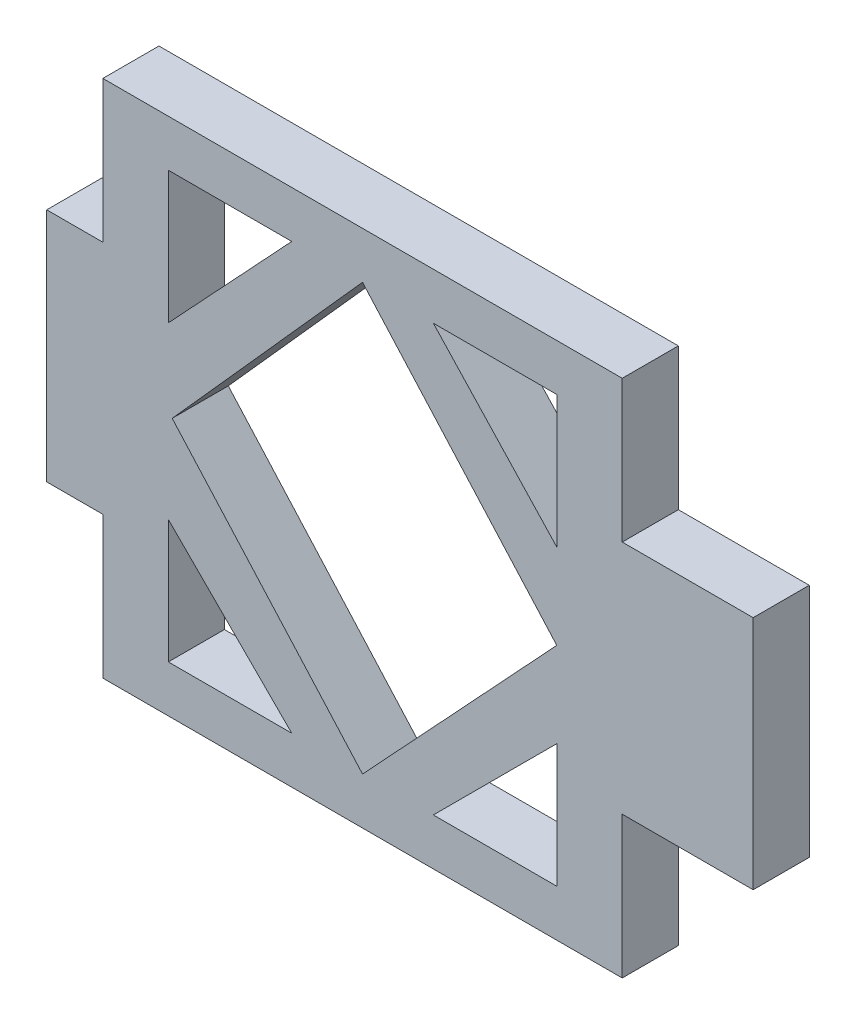
ISO-10303-21;
HEADER;
FILE_DESCRIPTION(('STEP AP214'),'2;1');
FILE_NAME('part.step','',(''),(''),'','','');
FILE_SCHEMA(('AUTOMOTIVE_DESIGN { 1 0 10303 214 1 1 1 1 }'));
ENDSEC;
DATA;
#1=APPLICATION_CONTEXT('core data for automotive mechanical design processes');
#2=APPLICATION_PROTOCOL_DEFINITION('international standard','automotive_design',2000,#1);
#3=PRODUCT_CONTEXT('',#1,'mechanical');
#4=PRODUCT('Part','Part','',(#3));
#5=PRODUCT_RELATED_PRODUCT_CATEGORY('part','',(#4));
#6=PRODUCT_DEFINITION_FORMATION('','',#4);
#7=PRODUCT_DEFINITION_CONTEXT('part definition',#1,'design');
#8=PRODUCT_DEFINITION('design','',#6,#7);
#9=PRODUCT_DEFINITION_SHAPE('','',#8);
#10=(LENGTH_UNIT() NAMED_UNIT(*) SI_UNIT(.MILLI.,.METRE.));
#11=(NAMED_UNIT(*) PLANE_ANGLE_UNIT() SI_UNIT($,.RADIAN.));
#12=(NAMED_UNIT(*) SI_UNIT($,.STERADIAN.) SOLID_ANGLE_UNIT());
#13=UNCERTAINTY_MEASURE_WITH_UNIT(LENGTH_MEASURE(1.E-05),#10,'distance_accuracy_value','');
#14=(GEOMETRIC_REPRESENTATION_CONTEXT(3) GLOBAL_UNCERTAINTY_ASSIGNED_CONTEXT((#13)) GLOBAL_UNIT_ASSIGNED_CONTEXT((#10,
#11,#12)) REPRESENTATION_CONTEXT('',''));
#15=CARTESIAN_POINT('',(0.,0.,0.));
#16=DIRECTION('',(0.,0.,1.));
#17=DIRECTION('',(1.,0.,0.));
#18=AXIS2_PLACEMENT_3D('',#15,#16,#17);
#19=CARTESIAN_POINT('',(80.5662798092365,72.019007171846,3.));
#20=DIRECTION('',(-0.745547544836727,-0.66645244270535,0.));
#21=DIRECTION('',(0.66645244270535,-0.745547544836727,0.));
#22=AXIS2_PLACEMENT_3D('',#19,#20,#21);
#23=PLANE('',#22);
#24=DIRECTION('',(-0.66645244270535,0.745547544836727,0.));
#25=VECTOR('',#24,1.);
#26=CARTESIAN_POINT('',(80.5662798092365,72.019007171846,0.));
#27=LINE('',#26,#25);
#28=CARTESIAN_POINT('',(114.219837859486,34.3714182793308,0.));
#29=VERTEX_POINT('',#28);
#30=CARTESIAN_POINT('',(104.042671945993,45.7564182793308,0.));
#31=VERTEX_POINT('',#30);
#32=EDGE_CURVE('E361',#29,#31,#27,.T.);
#33=ORIENTED_EDGE('',*,*,#32,.T.);
#34=DIRECTION('',(0.,0.,-1.));
#35=VECTOR('',#34,1.);
#36=CARTESIAN_POINT('',(104.042671945993,45.7564182793308,3.));
#37=LINE('',#36,#35);
#38=CARTESIAN_POINT('',(104.042671945993,45.7564182793308,3.));
#39=VERTEX_POINT('',#38);
#40=EDGE_CURVE('E11',#39,#31,#37,.T.);
#41=ORIENTED_EDGE('',*,*,#40,.F.);
#42=DIRECTION('',(-0.66645244270535,0.745547544836727,0.));
#43=VECTOR('',#42,1.);
#44=CARTESIAN_POINT('',(80.5662798092365,72.019007171846,3.));
#45=LINE('',#44,#43);
#46=CARTESIAN_POINT('',(114.219837859486,34.3714182793308,3.));
#47=VERTEX_POINT('',#46);
#48=EDGE_CURVE('E247',#47,#39,#45,.T.);
#49=ORIENTED_EDGE('',*,*,#48,.F.);
#50=DIRECTION('',(0.,0.,-1.));
#51=VECTOR('',#50,1.);
#52=CARTESIAN_POINT('',(114.219837859486,34.3714182793308,3.));
#53=LINE('',#52,#51);
#54=EDGE_CURVE('E372',#47,#29,#53,.T.);
#55=ORIENTED_EDGE('',*,*,#54,.T.);
#56=EDGE_LOOP('',(#33,#41,#49,#55));
#57=FACE_BOUND('',#56,.T.);
#58=ADVANCED_FACE('F45',(#57),#23,.F.);
#59=CARTESIAN_POINT('',(35.0961152924257,-31.3727701581098,3.));
#60=DIRECTION('',(-0.745547544836728,0.66645244270535,0.));
#61=DIRECTION('',(-0.66645244270535,-0.745547544836728,0.));
#62=AXIS2_PLACEMENT_3D('',#59,#60,#61);
#63=PLANE('',#62);
#64=DIRECTION('',(0.66645244270535,0.745547544836728,0.));
#65=VECTOR('',#64,1.);
#66=CARTESIAN_POINT('',(35.0961152924257,-31.3727701581098,0.));
#67=LINE('',#66,#65);
#68=CARTESIAN_POINT('',(114.219837859486,57.1414182793308,0.));
#69=VERTEX_POINT('',#68);
#70=EDGE_CURVE('E253',#31,#69,#67,.T.);
#71=ORIENTED_EDGE('',*,*,#70,.T.);
#72=DIRECTION('',(0.,0.,-1.));
#73=VECTOR('',#72,1.);
#74=CARTESIAN_POINT('',(114.219837859486,57.1414182793308,3.));
#75=LINE('',#74,#73);
#76=CARTESIAN_POINT('',(114.219837859486,57.1414182793308,3.));
#77=VERTEX_POINT('',#76);
#78=EDGE_CURVE('E56',#77,#69,#75,.T.);
#79=ORIENTED_EDGE('',*,*,#78,.F.);
#80=DIRECTION('',(0.66645244270535,0.745547544836728,0.));
#81=VECTOR('',#80,1.);
#82=CARTESIAN_POINT('',(35.0961152924257,-31.3727701581098,3.));
#83=LINE('',#82,#81);
#84=EDGE_CURVE('E241',#39,#77,#83,.T.);
#85=ORIENTED_EDGE('',*,*,#84,.F.);
#86=ORIENTED_EDGE('',*,*,#40,.T.);
#87=EDGE_LOOP('',(#71,#79,#85,#86));
#88=FACE_BOUND('',#87,.T.);
#89=ADVANCED_FACE('F252',(#88),#63,.F.);
#90=CARTESIAN_POINT('',(91.8800548486988,82.1325043773391,3.));
#91=DIRECTION('',(0.745547544836727,0.666452442705351,0.));
#92=DIRECTION('',(-0.666452442705351,0.745547544836727,0.));
#93=AXIS2_PLACEMENT_3D('',#90,#91,#92);
#94=PLANE('',#93);
#95=DIRECTION('',(0.666452442705351,-0.745547544836727,0.));
#96=VECTOR('',#95,1.);
#97=CARTESIAN_POINT('',(91.8800548486988,82.1325043773391,0.));
#98=LINE('',#97,#96);
#99=CARTESIAN_POINT('',(124.604837859486,45.5239182793309,0.));
#100=VERTEX_POINT('',#99);
#101=EDGE_CURVE('E154',#69,#100,#98,.T.);
#102=ORIENTED_EDGE('',*,*,#101,.T.);
#103=DIRECTION('',(0.,0.,-1.));
#104=VECTOR('',#103,1.);
#105=CARTESIAN_POINT('',(124.604837859486,45.5239182793309,3.));
#106=LINE('',#105,#104);
#107=CARTESIAN_POINT('',(124.604837859486,45.5239182793309,3.));
#108=VERTEX_POINT('',#107);
#109=EDGE_CURVE('E255',#108,#100,#106,.T.);
#110=ORIENTED_EDGE('',*,*,#109,.F.);
#111=DIRECTION('',(0.666452442705351,-0.745547544836727,0.));
#112=VECTOR('',#111,1.);
#113=CARTESIAN_POINT('',(91.8800548486988,82.1325043773391,3.));
#114=LINE('',#113,#112);
#115=EDGE_CURVE('E245',#77,#108,#114,.T.);
#116=ORIENTED_EDGE('',*,*,#115,.F.);
#117=ORIENTED_EDGE('',*,*,#78,.T.);
#118=EDGE_LOOP('',(#102,#110,#116,#117));
#119=FACE_BOUND('',#118,.T.);
#120=ADVANCED_FACE('F257',(#119),#94,.F.);
#121=CARTESIAN_POINT('',(0.,39.456418279331,3.));
#122=DIRECTION('',(0.,-1.,0.));
#123=DIRECTION('',(1.,0.,0.));
#124=AXIS2_PLACEMENT_3D('',#121,#122,#123);
#125=PLANE('',#124);
#126=DIRECTION('',(-1.,0.,0.));
#127=VECTOR('',#126,1.);
#128=CARTESIAN_POINT('',(0.,39.456418279331,0.));
#129=LINE('',#128,#127);
#130=CARTESIAN_POINT('',(100.334837859486,39.4564182793308,0.));
#131=VERTEX_POINT('',#130);
#132=CARTESIAN_POINT('',(97.3348378594857,39.4564182793308,0.));
#133=VERTEX_POINT('',#132);
#134=EDGE_CURVE('E313',#131,#133,#129,.T.);
#135=ORIENTED_EDGE('',*,*,#134,.F.);
#136=DIRECTION('',(0.,0.,-1.));
#137=VECTOR('',#136,1.);
#138=CARTESIAN_POINT('',(100.334837859486,39.4564182793308,3.));
#139=LINE('',#138,#137);
#140=CARTESIAN_POINT('',(100.334837859486,39.4564182793308,3.));
#141=VERTEX_POINT('',#140);
#142=EDGE_CURVE('E375',#141,#131,#139,.T.);
#143=ORIENTED_EDGE('',*,*,#142,.F.);
#144=DIRECTION('',(-1.,0.,0.));
#145=VECTOR('',#144,1.);
#146=CARTESIAN_POINT('',(0.,39.456418279331,3.));
#147=LINE('',#146,#145);
#148=CARTESIAN_POINT('',(97.3348378594857,39.4564182793308,3.));
#149=VERTEX_POINT('',#148);
#150=EDGE_CURVE('E510',#141,#149,#147,.T.);
#151=ORIENTED_EDGE('',*,*,#150,.T.);
#152=DIRECTION('',(0.,0.,-1.));
#153=VECTOR('',#152,1.);
#154=CARTESIAN_POINT('',(97.3348378594857,39.4564182793308,3.));
#155=LINE('',#154,#153);
#156=EDGE_CURVE('E378',#149,#133,#155,.T.);
#157=ORIENTED_EDGE('',*,*,#156,.T.);
#158=EDGE_LOOP('',(#135,#143,#151,#157));
#159=FACE_BOUND('',#158,.T.);
#160=ADVANCED_FACE('F566',(#159),#125,.T.);
#161=CARTESIAN_POINT('',(100.334837859486,0.,3.));
#162=DIRECTION('',(-1.,0.,0.));
#163=DIRECTION('',(0.,0.,1.));
#164=AXIS2_PLACEMENT_3D('',#161,#162,#163);
#165=PLANE('',#164);
#166=DIRECTION('',(0.,1.,0.));
#167=VECTOR('',#166,1.);
#168=CARTESIAN_POINT('',(100.334837859486,0.,0.));
#169=LINE('',#168,#167);
#170=CARTESIAN_POINT('',(100.334837859486,31.8714182793308,0.));
#171=VERTEX_POINT('',#170);
#172=EDGE_CURVE('E317',#171,#131,#169,.T.);
#173=ORIENTED_EDGE('',*,*,#172,.F.);
#174=DIRECTION('',(0.,0.,-1.));
#175=VECTOR('',#174,1.);
#176=CARTESIAN_POINT('',(100.334837859486,31.8714182793308,3.));
#177=LINE('',#176,#175);
#178=CARTESIAN_POINT('',(100.334837859486,31.8714182793308,3.));
#179=VERTEX_POINT('',#178);
#180=EDGE_CURVE('E415',#179,#171,#177,.T.);
#181=ORIENTED_EDGE('',*,*,#180,.F.);
#182=DIRECTION('',(0.,1.,0.));
#183=VECTOR('',#182,1.);
#184=CARTESIAN_POINT('',(100.334837859486,0.,3.));
#185=LINE('',#184,#183);
#186=EDGE_CURVE('E514',#179,#141,#185,.T.);
#187=ORIENTED_EDGE('',*,*,#186,.T.);
#188=ORIENTED_EDGE('',*,*,#142,.T.);
#189=EDGE_LOOP('',(#173,#181,#187,#188));
#190=FACE_BOUND('',#189,.T.);
#191=ADVANCED_FACE('F569',(#190),#165,.T.);
#192=CARTESIAN_POINT('',(0.,31.8714182793309,3.));
#193=DIRECTION('',(0.,-1.,0.));
#194=DIRECTION('',(1.,0.,0.));
#195=AXIS2_PLACEMENT_3D('',#192,#193,#194);
#196=PLANE('',#195);
#197=DIRECTION('',(-1.,0.,0.));
#198=VECTOR('',#197,1.);
#199=CARTESIAN_POINT('',(0.,31.8714182793309,0.));
#200=LINE('',#199,#198);
#201=CARTESIAN_POINT('',(128.104837859486,31.8714182793308,0.));
#202=VERTEX_POINT('',#201);
#203=EDGE_CURVE('E321',#202,#171,#200,.T.);
#204=ORIENTED_EDGE('',*,*,#203,.F.);
#205=DIRECTION('',(0.,0.,-1.));
#206=VECTOR('',#205,1.);
#207=CARTESIAN_POINT('',(128.104837859486,31.8714182793308,3.));
#208=LINE('',#207,#206);
#209=CARTESIAN_POINT('',(128.104837859486,31.8714182793308,3.));
#210=VERTEX_POINT('',#209);
#211=EDGE_CURVE('E412',#210,#202,#208,.T.);
#212=ORIENTED_EDGE('',*,*,#211,.F.);
#213=DIRECTION('',(-1.,0.,0.));
#214=VECTOR('',#213,1.);
#215=CARTESIAN_POINT('',(0.,31.8714182793309,3.));
#216=LINE('',#215,#214);
#217=EDGE_CURVE('E518',#210,#179,#216,.T.);
#218=ORIENTED_EDGE('',*,*,#217,.T.);
#219=ORIENTED_EDGE('',*,*,#180,.T.);
#220=EDGE_LOOP('',(#204,#212,#218,#219));
#221=FACE_BOUND('',#220,.T.);
#222=ADVANCED_FACE('F574',(#221),#196,.T.);
#223=CARTESIAN_POINT('',(128.104837859486,-4.68770403946847E-13,3.));
#224=DIRECTION('',(1.,0.,0.));
#225=DIRECTION('',(0.,1.,0.));
#226=AXIS2_PLACEMENT_3D('',#223,#224,#225);
#227=PLANE('',#226);
#228=DIRECTION('',(0.,-1.,0.));
#229=VECTOR('',#228,1.);
#230=CARTESIAN_POINT('',(128.104837859486,-4.68770403946847E-13,0.));
#231=LINE('',#230,#229);
#232=CARTESIAN_POINT('',(128.104837859486,39.4564182793308,0.));
#233=VERTEX_POINT('',#232);
#234=EDGE_CURVE('E325',#233,#202,#231,.T.);
#235=ORIENTED_EDGE('',*,*,#234,.F.);
#236=DIRECTION('',(0.,0.,-1.));
#237=VECTOR('',#236,1.);
#238=CARTESIAN_POINT('',(128.104837859486,39.4564182793308,3.));
#239=LINE('',#238,#237);
#240=CARTESIAN_POINT('',(128.104837859486,39.4564182793308,3.));
#241=VERTEX_POINT('',#240);
#242=EDGE_CURVE('E409',#241,#233,#239,.T.);
#243=ORIENTED_EDGE('',*,*,#242,.F.);
#244=DIRECTION('',(0.,-1.,0.));
#245=VECTOR('',#244,1.);
#246=CARTESIAN_POINT('',(128.104837859486,-4.68770403946847E-13,3.));
#247=LINE('',#246,#245);
#248=EDGE_CURVE('E522',#241,#210,#247,.T.);
#249=ORIENTED_EDGE('',*,*,#248,.T.);
#250=ORIENTED_EDGE('',*,*,#211,.T.);
#251=EDGE_LOOP('',(#235,#243,#249,#250));
#252=FACE_BOUND('',#251,.T.);
#253=ADVANCED_FACE('F577',(#252),#227,.T.);
#254=CARTESIAN_POINT('',(0.,39.4564182793308,3.));
#255=DIRECTION('',(0.,-1.,0.));
#256=DIRECTION('',(0.,0.,-1.));
#257=AXIS2_PLACEMENT_3D('',#254,#255,#256);
#258=PLANE('',#257);
#259=DIRECTION('',(-1.,0.,0.));
#260=VECTOR('',#259,1.);
#261=CARTESIAN_POINT('',(0.,39.4564182793308,0.));
#262=LINE('',#261,#260);
#263=CARTESIAN_POINT('',(135.104837859486,39.4564182793308,0.));
#264=VERTEX_POINT('',#263);
#265=EDGE_CURVE('E329',#264,#233,#262,.T.);
#266=ORIENTED_EDGE('',*,*,#265,.F.);
#267=DIRECTION('',(0.,0.,-1.));
#268=VECTOR('',#267,1.);
#269=CARTESIAN_POINT('',(135.104837859486,39.4564182793308,3.));
#270=LINE('',#269,#268);
#271=CARTESIAN_POINT('',(135.104837859486,39.4564182793308,3.));
#272=VERTEX_POINT('',#271);
#273=EDGE_CURVE('E406',#272,#264,#270,.T.);
#274=ORIENTED_EDGE('',*,*,#273,.F.);
#275=DIRECTION('',(-1.,0.,0.));
#276=VECTOR('',#275,1.);
#277=CARTESIAN_POINT('',(0.,39.4564182793308,3.));
#278=LINE('',#277,#276);
#279=EDGE_CURVE('E526',#272,#241,#278,.T.);
#280=ORIENTED_EDGE('',*,*,#279,.T.);
#281=ORIENTED_EDGE('',*,*,#242,.T.);
#282=EDGE_LOOP('',(#266,#274,#280,#281));
#283=FACE_BOUND('',#282,.T.);
#284=ADVANCED_FACE('F581',(#283),#258,.T.);
#285=CARTESIAN_POINT('',(135.104837859486,0.,3.));
#286=DIRECTION('',(-1.,0.,0.));
#287=DIRECTION('',(0.,0.,1.));
#288=AXIS2_PLACEMENT_3D('',#285,#286,#287);
#289=PLANE('',#288);
#290=DIRECTION('',(0.,1.,0.));
#291=VECTOR('',#290,1.);
#292=CARTESIAN_POINT('',(135.104837859486,0.,0.));
#293=LINE('',#292,#291);
#294=CARTESIAN_POINT('',(135.104837859486,52.0564182793308,0.));
#295=VERTEX_POINT('',#294);
#296=EDGE_CURVE('E333',#264,#295,#293,.T.);
#297=ORIENTED_EDGE('',*,*,#296,.T.);
#298=DIRECTION('',(0.,0.,-1.));
#299=VECTOR('',#298,1.);
#300=CARTESIAN_POINT('',(135.104837859486,52.0564182793308,3.));
#301=LINE('',#300,#299);
#302=CARTESIAN_POINT('',(135.104837859486,52.0564182793308,3.));
#303=VERTEX_POINT('',#302);
#304=EDGE_CURVE('E402',#303,#295,#301,.T.);
#305=ORIENTED_EDGE('',*,*,#304,.F.);
#306=DIRECTION('',(0.,1.,0.));
#307=VECTOR('',#306,1.);
#308=CARTESIAN_POINT('',(135.104837859486,0.,3.));
#309=LINE('',#308,#307);
#310=EDGE_CURVE('E530',#272,#303,#309,.T.);
#311=ORIENTED_EDGE('',*,*,#310,.F.);
#312=ORIENTED_EDGE('',*,*,#273,.T.);
#313=EDGE_LOOP('',(#297,#305,#311,#312));
#314=FACE_BOUND('',#313,.T.);
#315=ADVANCED_FACE('F586',(#314),#289,.F.);
#316=CARTESIAN_POINT('',(0.,52.0564182793308,3.));
#317=DIRECTION('',(0.,-1.,0.));
#318=DIRECTION('',(0.,0.,-1.));
#319=AXIS2_PLACEMENT_3D('',#316,#317,#318);
#320=PLANE('',#319);
#321=DIRECTION('',(-1.,0.,0.));
#322=VECTOR('',#321,1.);
#323=CARTESIAN_POINT('',(0.,52.0564182793308,0.));
#324=LINE('',#323,#322);
#325=CARTESIAN_POINT('',(128.104837859486,52.0564182793308,0.));
#326=VERTEX_POINT('',#325);
#327=EDGE_CURVE('E337',#295,#326,#324,.T.);
#328=ORIENTED_EDGE('',*,*,#327,.T.);
#329=DIRECTION('',(0.,0.,-1.));
#330=VECTOR('',#329,1.);
#331=CARTESIAN_POINT('',(128.104837859486,52.0564182793308,3.));
#332=LINE('',#331,#330);
#333=CARTESIAN_POINT('',(128.104837859486,52.0564182793308,3.));
#334=VERTEX_POINT('',#333);
#335=EDGE_CURVE('E398',#334,#326,#332,.T.);
#336=ORIENTED_EDGE('',*,*,#335,.F.);
#337=DIRECTION('',(-1.,0.,0.));
#338=VECTOR('',#337,1.);
#339=CARTESIAN_POINT('',(0.,52.0564182793308,3.));
#340=LINE('',#339,#338);
#341=EDGE_CURVE('E534',#303,#334,#340,.T.);
#342=ORIENTED_EDGE('',*,*,#341,.F.);
#343=ORIENTED_EDGE('',*,*,#304,.T.);
#344=EDGE_LOOP('',(#328,#336,#342,#343));
#345=FACE_BOUND('',#344,.T.);
#346=ADVANCED_FACE('F590',(#345),#320,.F.);
#347=CARTESIAN_POINT('',(128.104837859486,4.68770403946848E-13,3.));
#348=DIRECTION('',(-1.,0.,0.));
#349=DIRECTION('',(0.,-1.,0.));
#350=AXIS2_PLACEMENT_3D('',#347,#348,#349);
#351=PLANE('',#350);
#352=DIRECTION('',(0.,1.,0.));
#353=VECTOR('',#352,1.);
#354=CARTESIAN_POINT('',(128.104837859486,4.68770403946848E-13,0.));
#355=LINE('',#354,#353);
#356=CARTESIAN_POINT('',(128.104837859486,59.6414182793308,0.));
#357=VERTEX_POINT('',#356);
#358=EDGE_CURVE('E341',#326,#357,#355,.T.);
#359=ORIENTED_EDGE('',*,*,#358,.T.);
#360=DIRECTION('',(0.,0.,-1.));
#361=VECTOR('',#360,1.);
#362=CARTESIAN_POINT('',(128.104837859486,59.6414182793308,3.));
#363=LINE('',#362,#361);
#364=CARTESIAN_POINT('',(128.104837859486,59.6414182793308,3.));
#365=VERTEX_POINT('',#364);
#366=EDGE_CURVE('E394',#365,#357,#363,.T.);
#367=ORIENTED_EDGE('',*,*,#366,.F.);
#368=DIRECTION('',(0.,1.,0.));
#369=VECTOR('',#368,1.);
#370=CARTESIAN_POINT('',(128.104837859486,4.68770403946848E-13,3.));
#371=LINE('',#370,#369);
#372=EDGE_CURVE('E538',#334,#365,#371,.T.);
#373=ORIENTED_EDGE('',*,*,#372,.F.);
#374=ORIENTED_EDGE('',*,*,#335,.T.);
#375=EDGE_LOOP('',(#359,#367,#373,#374));
#376=FACE_BOUND('',#375,.T.);
#377=ADVANCED_FACE('F592',(#376),#351,.F.);
#378=CARTESIAN_POINT('',(0.,59.6414182793309,3.));
#379=DIRECTION('',(0.,-1.,0.));
#380=DIRECTION('',(1.,0.,0.));
#381=AXIS2_PLACEMENT_3D('',#378,#379,#380);
#382=PLANE('',#381);
#383=DIRECTION('',(-1.,0.,0.));
#384=VECTOR('',#383,1.);
#385=CARTESIAN_POINT('',(0.,59.6414182793309,0.));
#386=LINE('',#385,#384);
#387=CARTESIAN_POINT('',(100.334837859486,59.6414182793308,0.));
#388=VERTEX_POINT('',#387);
#389=EDGE_CURVE('E345',#357,#388,#386,.T.);
#390=ORIENTED_EDGE('',*,*,#389,.T.);
#391=DIRECTION('',(0.,0.,-1.));
#392=VECTOR('',#391,1.);
#393=CARTESIAN_POINT('',(100.334837859486,59.6414182793308,3.));
#394=LINE('',#393,#392);
#395=CARTESIAN_POINT('',(100.334837859486,59.6414182793308,3.));
#396=VERTEX_POINT('',#395);
#397=EDGE_CURVE('E390',#396,#388,#394,.T.);
#398=ORIENTED_EDGE('',*,*,#397,.F.);
#399=DIRECTION('',(-1.,0.,0.));
#400=VECTOR('',#399,1.);
#401=CARTESIAN_POINT('',(0.,59.6414182793309,3.));
#402=LINE('',#401,#400);
#403=EDGE_CURVE('E542',#365,#396,#402,.T.);
#404=ORIENTED_EDGE('',*,*,#403,.F.);
#405=ORIENTED_EDGE('',*,*,#366,.T.);
#406=EDGE_LOOP('',(#390,#398,#404,#405));
#407=FACE_BOUND('',#406,.T.);
#408=ADVANCED_FACE('F594',(#407),#382,.F.);
#409=CARTESIAN_POINT('',(100.334837859485,-7.34304859351563E-13,3.));
#410=DIRECTION('',(1.,0.,0.));
#411=DIRECTION('',(0.,1.,0.));
#412=AXIS2_PLACEMENT_3D('',#409,#410,#411);
#413=PLANE('',#412);
#414=DIRECTION('',(0.,-1.,0.));
#415=VECTOR('',#414,1.);
#416=CARTESIAN_POINT('',(100.334837859485,-7.34304859351563E-13,0.));
#417=LINE('',#416,#415);
#418=CARTESIAN_POINT('',(100.334837859486,52.0564182793308,0.));
#419=VERTEX_POINT('',#418);
#420=EDGE_CURVE('E349',#388,#419,#417,.T.);
#421=ORIENTED_EDGE('',*,*,#420,.T.);
#422=DIRECTION('',(0.,0.,-1.));
#423=VECTOR('',#422,1.);
#424=CARTESIAN_POINT('',(100.334837859486,52.0564182793308,3.));
#425=LINE('',#424,#423);
#426=CARTESIAN_POINT('',(100.334837859486,52.0564182793308,3.));
#427=VERTEX_POINT('',#426);
#428=EDGE_CURVE('E386',#427,#419,#425,.T.);
#429=ORIENTED_EDGE('',*,*,#428,.F.);
#430=DIRECTION('',(0.,-1.,0.));
#431=VECTOR('',#430,1.);
#432=CARTESIAN_POINT('',(100.334837859485,-7.34304859351563E-13,3.));
#433=LINE('',#432,#431);
#434=EDGE_CURVE('E546',#396,#427,#433,.T.);
#435=ORIENTED_EDGE('',*,*,#434,.F.);
#436=ORIENTED_EDGE('',*,*,#397,.T.);
#437=EDGE_LOOP('',(#421,#429,#435,#436));
#438=FACE_BOUND('',#437,.T.);
#439=ADVANCED_FACE('F598',(#438),#413,.F.);
#440=CARTESIAN_POINT('',(-1.20404654485899E-13,52.0564182793306,3.));
#441=DIRECTION('',(0.,-1.,0.));
#442=DIRECTION('',(1.,0.,0.));
#443=AXIS2_PLACEMENT_3D('',#440,#441,#442);
#444=PLANE('',#443);
#445=DIRECTION('',(-1.,0.,0.));
#446=VECTOR('',#445,1.);
#447=CARTESIAN_POINT('',(-1.20404654485899E-13,52.0564182793306,0.));
#448=LINE('',#447,#446);
#449=CARTESIAN_POINT('',(97.3348378594857,52.0564182793308,0.));
#450=VERTEX_POINT('',#449);
#451=EDGE_CURVE('E353',#419,#450,#448,.T.);
#452=ORIENTED_EDGE('',*,*,#451,.T.);
#453=DIRECTION('',(0.,0.,-1.));
#454=VECTOR('',#453,1.);
#455=CARTESIAN_POINT('',(97.3348378594857,52.0564182793308,3.));
#456=LINE('',#455,#454);
#457=CARTESIAN_POINT('',(97.3348378594857,52.0564182793308,3.));
#458=VERTEX_POINT('',#457);
#459=EDGE_CURVE('E381',#458,#450,#456,.T.);
#460=ORIENTED_EDGE('',*,*,#459,.F.);
#461=DIRECTION('',(-1.,0.,0.));
#462=VECTOR('',#461,1.);
#463=CARTESIAN_POINT('',(-1.20404654485899E-13,52.0564182793306,3.));
#464=LINE('',#463,#462);
#465=EDGE_CURVE('E550',#427,#458,#464,.T.);
#466=ORIENTED_EDGE('',*,*,#465,.F.);
#467=ORIENTED_EDGE('',*,*,#428,.T.);
#468=EDGE_LOOP('',(#452,#460,#466,#467));
#469=FACE_BOUND('',#468,.T.);
#470=ADVANCED_FACE('F600',(#469),#444,.F.);
#471=CARTESIAN_POINT('',(30.5066493969472,-28.4786260282674,3.));
#472=DIRECTION('',(-0.730986499778758,0.682391923414397,0.));
#473=DIRECTION('',(-0.682391923414397,-0.730986499778758,0.));
#474=AXIS2_PLACEMENT_3D('',#471,#472,#473);
#475=PLANE('',#474);
#476=DIRECTION('',(0.682391923414397,0.730986499778758,0.));
#477=VECTOR('',#476,1.);
#478=CARTESIAN_POINT('',(30.5066493969472,-28.4786260282674,0.));
#479=LINE('',#478,#477);
#480=CARTESIAN_POINT('',(103.834837859486,50.0714182793308,0.));
#481=VERTEX_POINT('',#480);
#482=CARTESIAN_POINT('',(110.434837859486,57.1414182793308,0.));
#483=VERTEX_POINT('',#482);
#484=EDGE_CURVE('E301',#481,#483,#479,.T.);
#485=ORIENTED_EDGE('',*,*,#484,.F.);
#486=DIRECTION('',(0.,0.,-1.));
#487=VECTOR('',#486,1.);
#488=CARTESIAN_POINT('',(103.834837859486,50.0714182793308,3.));
#489=LINE('',#488,#487);
#490=CARTESIAN_POINT('',(103.834837859486,50.0714182793308,3.));
#491=VERTEX_POINT('',#490);
#492=EDGE_CURVE('E382',#491,#481,#489,.T.);
#493=ORIENTED_EDGE('',*,*,#492,.F.);
#494=DIRECTION('',(0.682391923414397,0.730986499778758,0.));
#495=VECTOR('',#494,1.);
#496=CARTESIAN_POINT('',(30.5066493969472,-28.4786260282674,3.));
#497=LINE('',#496,#495);
#498=CARTESIAN_POINT('',(110.434837859486,57.1414182793308,3.));
#499=VERTEX_POINT('',#498);
#500=EDGE_CURVE('E498',#491,#499,#497,.T.);
#501=ORIENTED_EDGE('',*,*,#500,.T.);
#502=DIRECTION('',(0.,0.,-1.));
#503=VECTOR('',#502,1.);
#504=CARTESIAN_POINT('',(110.434837859486,57.1414182793308,3.));
#505=LINE('',#504,#503);
#506=EDGE_CURVE('E420',#499,#483,#505,.T.);
#507=ORIENTED_EDGE('',*,*,#506,.T.);
#508=EDGE_LOOP('',(#485,#493,#501,#507));
#509=FACE_BOUND('',#508,.T.);
#510=ADVANCED_FACE('F630',(#509),#475,.T.);
#511=CARTESIAN_POINT('',(103.834837859486,0.,3.));
#512=DIRECTION('',(1.,0.,0.));
#513=DIRECTION('',(0.,0.,-1.));
#514=AXIS2_PLACEMENT_3D('',#511,#512,#513);
#515=PLANE('',#514);
#516=DIRECTION('',(0.,-1.,0.));
#517=VECTOR('',#516,1.);
#518=CARTESIAN_POINT('',(103.834837859486,0.,0.));
#519=LINE('',#518,#517);
#520=CARTESIAN_POINT('',(103.834837859486,57.1414182793308,0.));
#521=VERTEX_POINT('',#520);
#522=EDGE_CURVE('E305',#521,#481,#519,.T.);
#523=ORIENTED_EDGE('',*,*,#522,.F.);
#524=DIRECTION('',(0.,0.,-1.));
#525=VECTOR('',#524,1.);
#526=CARTESIAN_POINT('',(103.834837859486,57.1414182793308,3.));
#527=LINE('',#526,#525);
#528=CARTESIAN_POINT('',(103.834837859486,57.1414182793308,3.));
#529=VERTEX_POINT('',#528);
#530=EDGE_CURVE('E423',#529,#521,#527,.T.);
#531=ORIENTED_EDGE('',*,*,#530,.F.);
#532=DIRECTION('',(0.,-1.,0.));
#533=VECTOR('',#532,1.);
#534=CARTESIAN_POINT('',(103.834837859486,0.,3.));
#535=LINE('',#534,#533);
#536=EDGE_CURVE('E502',#529,#491,#535,.T.);
#537=ORIENTED_EDGE('',*,*,#536,.T.);
#538=ORIENTED_EDGE('',*,*,#492,.T.);
#539=EDGE_LOOP('',(#523,#531,#537,#538));
#540=FACE_BOUND('',#539,.T.);
#541=ADVANCED_FACE('F655',(#540),#515,.T.);
#542=CARTESIAN_POINT('',(72.4031280694083,72.4031280694082,3.));
#543=DIRECTION('',(-0.707106781186548,-0.707106781186547,0.));
#544=DIRECTION('',(0.707106781186547,-0.707106781186548,0.));
#545=AXIS2_PLACEMENT_3D('',#542,#543,#544);
#546=PLANE('',#545);
#547=DIRECTION('',(-0.707106781186547,0.707106781186548,0.));
#548=VECTOR('',#547,1.);
#549=CARTESIAN_POINT('',(72.4031280694083,72.4031280694082,0.));
#550=LINE('',#549,#548);
#551=CARTESIAN_POINT('',(110.434837859486,34.3714182793308,0.));
#552=VERTEX_POINT('',#551);
#553=CARTESIAN_POINT('',(103.834837859486,40.9714182793308,0.));
#554=VERTEX_POINT('',#553);
#555=EDGE_CURVE('E289',#552,#554,#550,.T.);
#556=ORIENTED_EDGE('',*,*,#555,.F.);
#557=DIRECTION('',(0.,0.,-1.));
#558=VECTOR('',#557,1.);
#559=CARTESIAN_POINT('',(110.434837859486,34.3714182793308,3.));
#560=LINE('',#559,#558);
#561=CARTESIAN_POINT('',(110.434837859486,34.3714182793308,3.));
#562=VERTEX_POINT('',#561);
#563=EDGE_CURVE('E424',#562,#552,#560,.T.);
#564=ORIENTED_EDGE('',*,*,#563,.F.);
#565=DIRECTION('',(-0.707106781186547,0.707106781186548,0.));
#566=VECTOR('',#565,1.);
#567=CARTESIAN_POINT('',(72.4031280694083,72.4031280694082,3.));
#568=LINE('',#567,#566);
#569=CARTESIAN_POINT('',(103.834837859486,40.9714182793308,3.));
#570=VERTEX_POINT('',#569);
#571=EDGE_CURVE('E486',#562,#570,#568,.T.);
#572=ORIENTED_EDGE('',*,*,#571,.T.);
#573=DIRECTION('',(0.,0.,-1.));
#574=VECTOR('',#573,1.);
#575=CARTESIAN_POINT('',(103.834837859486,40.9714182793308,3.));
#576=LINE('',#575,#574);
#577=EDGE_CURVE('E429',#570,#554,#576,.T.);
#578=ORIENTED_EDGE('',*,*,#577,.T.);
#579=EDGE_LOOP('',(#556,#564,#572,#578));
#580=FACE_BOUND('',#579,.T.);
#581=ADVANCED_FACE('F658',(#580),#546,.T.);
#582=CARTESIAN_POINT('',(0.,34.3714182793308,3.));
#583=DIRECTION('',(0.,1.,0.));
#584=DIRECTION('',(0.,0.,1.));
#585=AXIS2_PLACEMENT_3D('',#582,#583,#584);
#586=PLANE('',#585);
#587=DIRECTION('',(1.,0.,0.));
#588=VECTOR('',#587,1.);
#589=CARTESIAN_POINT('',(0.,34.3714182793308,0.));
#590=LINE('',#589,#588);
#591=CARTESIAN_POINT('',(103.834837859486,34.3714182793308,0.));
#592=VERTEX_POINT('',#591);
#593=EDGE_CURVE('E293',#592,#552,#590,.T.);
#594=ORIENTED_EDGE('',*,*,#593,.F.);
#595=DIRECTION('',(0.,0.,-1.));
#596=VECTOR('',#595,1.);
#597=CARTESIAN_POINT('',(103.834837859486,34.3714182793308,3.));
#598=LINE('',#597,#596);
#599=CARTESIAN_POINT('',(103.834837859486,34.3714182793308,3.));
#600=VERTEX_POINT('',#599);
#601=EDGE_CURVE('E432',#600,#592,#598,.T.);
#602=ORIENTED_EDGE('',*,*,#601,.F.);
#603=DIRECTION('',(1.,0.,0.));
#604=VECTOR('',#603,1.);
#605=CARTESIAN_POINT('',(0.,34.3714182793308,3.));
#606=LINE('',#605,#604);
#607=EDGE_CURVE('E490',#600,#562,#606,.T.);
#608=ORIENTED_EDGE('',*,*,#607,.T.);
#609=ORIENTED_EDGE('',*,*,#563,.T.);
#610=EDGE_LOOP('',(#594,#602,#608,#609));
#611=FACE_BOUND('',#610,.T.);
#612=ADVANCED_FACE('F666',(#611),#586,.T.);
#613=CARTESIAN_POINT('',(41.8167097900776,-41.8167097900775,3.));
#614=DIRECTION('',(0.707106781186548,-0.707106781186546,0.));
#615=DIRECTION('',(0.707106781186546,0.707106781186549,0.));
#616=AXIS2_PLACEMENT_3D('',#613,#614,#615);
#617=PLANE('',#616);
#618=DIRECTION('',(-0.707106781186546,-0.707106781186549,0.));
#619=VECTOR('',#618,1.);
#620=CARTESIAN_POINT('',(41.8167097900776,-41.8167097900775,0.));
#621=LINE('',#620,#619);
#622=CARTESIAN_POINT('',(124.604837859486,40.9714182793309,0.));
#623=VERTEX_POINT('',#622);
#624=CARTESIAN_POINT('',(118.004837859486,34.3714182793308,0.));
#625=VERTEX_POINT('',#624);
#626=EDGE_CURVE('E277',#623,#625,#621,.T.);
#627=ORIENTED_EDGE('',*,*,#626,.F.);
#628=DIRECTION('',(0.,0.,-1.));
#629=VECTOR('',#628,1.);
#630=CARTESIAN_POINT('',(124.604837859486,40.9714182793309,3.));
#631=LINE('',#630,#629);
#632=CARTESIAN_POINT('',(124.604837859486,40.9714182793309,3.));
#633=VERTEX_POINT('',#632);
#634=EDGE_CURVE('E433',#633,#623,#631,.T.);
#635=ORIENTED_EDGE('',*,*,#634,.F.);
#636=DIRECTION('',(-0.707106781186546,-0.707106781186549,0.));
#637=VECTOR('',#636,1.);
#638=CARTESIAN_POINT('',(41.8167097900776,-41.8167097900775,3.));
#639=LINE('',#638,#637);
#640=CARTESIAN_POINT('',(118.004837859486,34.3714182793308,3.));
#641=VERTEX_POINT('',#640);
#642=EDGE_CURVE('E470',#633,#641,#639,.T.);
#643=ORIENTED_EDGE('',*,*,#642,.T.);
#644=DIRECTION('',(0.,0.,-1.));
#645=VECTOR('',#644,1.);
#646=CARTESIAN_POINT('',(118.004837859486,34.3714182793308,3.));
#647=LINE('',#646,#645);
#648=EDGE_CURVE('E438',#641,#625,#647,.T.);
#649=ORIENTED_EDGE('',*,*,#648,.T.);
#650=EDGE_LOOP('',(#627,#635,#643,#649));
#651=FACE_BOUND('',#650,.T.);
#652=ADVANCED_FACE('F669',(#651),#617,.T.);
#653=CARTESIAN_POINT('',(124.604837859486,0.,3.));
#654=DIRECTION('',(-1.,0.,0.));
#655=DIRECTION('',(0.,0.,1.));
#656=AXIS2_PLACEMENT_3D('',#653,#654,#655);
#657=PLANE('',#656);
#658=DIRECTION('',(0.,1.,0.));
#659=VECTOR('',#658,1.);
#660=CARTESIAN_POINT('',(124.604837859486,0.,0.));
#661=LINE('',#660,#659);
#662=CARTESIAN_POINT('',(124.604837859486,34.3714182793309,0.));
#663=VERTEX_POINT('',#662);
#664=EDGE_CURVE('E281',#663,#623,#661,.T.);
#665=ORIENTED_EDGE('',*,*,#664,.F.);
#666=DIRECTION('',(0.,0.,-1.));
#667=VECTOR('',#666,1.);
#668=CARTESIAN_POINT('',(124.604837859486,34.3714182793309,3.));
#669=LINE('',#668,#667);
#670=CARTESIAN_POINT('',(124.604837859486,34.3714182793309,3.));
#671=VERTEX_POINT('',#670);
#672=EDGE_CURVE('E441',#671,#663,#669,.T.);
#673=ORIENTED_EDGE('',*,*,#672,.F.);
#674=DIRECTION('',(0.,1.,0.));
#675=VECTOR('',#674,1.);
#676=CARTESIAN_POINT('',(124.604837859486,0.,3.));
#677=LINE('',#676,#675);
#678=EDGE_CURVE('E475',#671,#633,#677,.T.);
#679=ORIENTED_EDGE('',*,*,#678,.T.);
#680=ORIENTED_EDGE('',*,*,#634,.T.);
#681=EDGE_LOOP('',(#665,#673,#679,#680));
#682=FACE_BOUND('',#681,.T.);
#683=ADVANCED_FACE('F677',(#682),#657,.T.);
#684=CARTESIAN_POINT('',(91.5179261550851,85.4944533083596,3.));
#685=DIRECTION('',(0.730745634663305,0.682649849791621,0.));
#686=DIRECTION('',(-0.682649849791621,0.730745634663305,0.));
#687=AXIS2_PLACEMENT_3D('',#684,#685,#686);
#688=PLANE('',#687);
#689=DIRECTION('',(0.682649849791621,-0.730745634663305,0.));
#690=VECTOR('',#689,1.);
#691=CARTESIAN_POINT('',(91.5179261550851,85.4944533083596,0.));
#692=LINE('',#691,#690);
#693=CARTESIAN_POINT('',(118.004837859486,57.1414182793308,0.));
#694=VERTEX_POINT('',#693);
#695=CARTESIAN_POINT('',(124.604837859486,50.0764182793308,0.));
#696=VERTEX_POINT('',#695);
#697=EDGE_CURVE('E265',#694,#696,#692,.T.);
#698=ORIENTED_EDGE('',*,*,#697,.F.);
#699=DIRECTION('',(0.,0.,-1.));
#700=VECTOR('',#699,1.);
#701=CARTESIAN_POINT('',(118.004837859486,57.1414182793308,3.));
#702=LINE('',#701,#700);
#703=CARTESIAN_POINT('',(118.004837859486,57.1414182793308,3.));
#704=VERTEX_POINT('',#703);
#705=EDGE_CURVE('E49',#704,#694,#702,.T.);
#706=ORIENTED_EDGE('',*,*,#705,.F.);
#707=DIRECTION('',(0.682649849791621,-0.730745634663305,0.));
#708=VECTOR('',#707,1.);
#709=CARTESIAN_POINT('',(91.5179261550851,85.4944533083596,3.));
#710=LINE('',#709,#708);
#711=CARTESIAN_POINT('',(124.604837859486,50.0764182793308,3.));
#712=VERTEX_POINT('',#711);
#713=EDGE_CURVE('E371',#704,#712,#710,.T.);
#714=ORIENTED_EDGE('',*,*,#713,.T.);
#715=DIRECTION('',(0.,0.,-1.));
#716=VECTOR('',#715,1.);
#717=CARTESIAN_POINT('',(124.604837859486,50.0764182793308,3.));
#718=LINE('',#717,#716);
#719=EDGE_CURVE('E261',#712,#696,#718,.T.);
#720=ORIENTED_EDGE('',*,*,#719,.T.);
#721=EDGE_LOOP('',(#698,#706,#714,#720));
#722=FACE_BOUND('',#721,.T.);
#723=ADVANCED_FACE('F47',(#722),#688,.T.);
#724=CARTESIAN_POINT('',(0.,57.1414182793307,3.));
#725=DIRECTION('',(0.,-1.,0.));
#726=DIRECTION('',(1.,0.,0.));
#727=AXIS2_PLACEMENT_3D('',#724,#725,#726);
#728=PLANE('',#727);
#729=DIRECTION('',(-1.,0.,0.));
#730=VECTOR('',#729,1.);
#731=CARTESIAN_POINT('',(0.,57.1414182793307,0.));
#732=LINE('',#731,#730);
#733=CARTESIAN_POINT('',(124.604837859486,57.1414182793308,0.));
#734=VERTEX_POINT('',#733);
#735=EDGE_CURVE('E269',#734,#694,#732,.T.);
#736=ORIENTED_EDGE('',*,*,#735,.F.);
#737=DIRECTION('',(0.,0.,-1.));
#738=VECTOR('',#737,1.);
#739=CARTESIAN_POINT('',(124.604837859486,57.1414182793308,3.));
#740=LINE('',#739,#738);
#741=CARTESIAN_POINT('',(124.604837859486,57.1414182793308,3.));
#742=VERTEX_POINT('',#741);
#743=EDGE_CURVE('E447',#742,#734,#740,.T.);
#744=ORIENTED_EDGE('',*,*,#743,.F.);
#745=DIRECTION('',(-1.,0.,0.));
#746=VECTOR('',#745,1.);
#747=CARTESIAN_POINT('',(0.,57.1414182793307,3.));
#748=LINE('',#747,#746);
#749=EDGE_CURVE('E458',#742,#704,#748,.T.);
#750=ORIENTED_EDGE('',*,*,#749,.T.);
#751=ORIENTED_EDGE('',*,*,#705,.T.);
#752=EDGE_LOOP('',(#736,#744,#750,#751));
#753=FACE_BOUND('',#752,.T.);
#754=ADVANCED_FACE('F456',(#753),#728,.T.);
#755=CARTESIAN_POINT('',(97.3348378594857,0.,3.));
#756=DIRECTION('',(1.,0.,0.));
#757=DIRECTION('',(0.,0.,-1.));
#758=AXIS2_PLACEMENT_3D('',#755,#756,#757);
#759=PLANE('',#758);
#760=DIRECTION('',(0.,-1.,0.));
#761=VECTOR('',#760,1.);
#762=CARTESIAN_POINT('',(97.3348378594857,0.,0.));
#763=LINE('',#762,#761);
#764=EDGE_CURVE('E357',#450,#133,#763,.T.);
#765=ORIENTED_EDGE('',*,*,#764,.T.);
#766=ORIENTED_EDGE('',*,*,#156,.F.);
#767=DIRECTION('',(0.,-1.,0.));
#768=VECTOR('',#767,1.);
#769=CARTESIAN_POINT('',(97.3348378594857,0.,3.));
#770=LINE('',#769,#768);
#771=EDGE_CURVE('E554',#458,#149,#770,.T.);
#772=ORIENTED_EDGE('',*,*,#771,.F.);
#773=ORIENTED_EDGE('',*,*,#459,.T.);
#774=EDGE_LOOP('',(#765,#766,#772,#773));
#775=FACE_BOUND('',#774,.T.);
#776=ADVANCED_FACE('F563',(#775),#759,.F.);
#777=CARTESIAN_POINT('',(0.,57.1414182793308,3.));
#778=DIRECTION('',(0.,-1.,0.));
#779=DIRECTION('',(0.,0.,-1.));
#780=AXIS2_PLACEMENT_3D('',#777,#778,#779);
#781=PLANE('',#780);
#782=DIRECTION('',(-1.,0.,0.));
#783=VECTOR('',#782,1.);
#784=CARTESIAN_POINT('',(0.,57.1414182793308,0.));
#785=LINE('',#784,#783);
#786=EDGE_CURVE('E309',#483,#521,#785,.T.);
#787=ORIENTED_EDGE('',*,*,#786,.F.);
#788=ORIENTED_EDGE('',*,*,#506,.F.);
#789=DIRECTION('',(-1.,0.,0.));
#790=VECTOR('',#789,1.);
#791=CARTESIAN_POINT('',(0.,57.1414182793308,3.));
#792=LINE('',#791,#790);
#793=EDGE_CURVE('E506',#499,#529,#792,.T.);
#794=ORIENTED_EDGE('',*,*,#793,.T.);
#795=ORIENTED_EDGE('',*,*,#530,.T.);
#796=EDGE_LOOP('',(#787,#788,#794,#795));
#797=FACE_BOUND('',#796,.T.);
#798=ADVANCED_FACE('F627',(#797),#781,.T.);
#799=CARTESIAN_POINT('',(103.834837859486,0.,3.));
#800=DIRECTION('',(1.,0.,0.));
#801=DIRECTION('',(0.,0.,-1.));
#802=AXIS2_PLACEMENT_3D('',#799,#800,#801);
#803=PLANE('',#802);
#804=DIRECTION('',(0.,-1.,0.));
#805=VECTOR('',#804,1.);
#806=CARTESIAN_POINT('',(103.834837859486,0.,0.));
#807=LINE('',#806,#805);
#808=EDGE_CURVE('E297',#554,#592,#807,.T.);
#809=ORIENTED_EDGE('',*,*,#808,.F.);
#810=ORIENTED_EDGE('',*,*,#577,.F.);
#811=DIRECTION('',(0.,-1.,0.));
#812=VECTOR('',#811,1.);
#813=CARTESIAN_POINT('',(103.834837859486,0.,3.));
#814=LINE('',#813,#812);
#815=EDGE_CURVE('E494',#570,#600,#814,.T.);
#816=ORIENTED_EDGE('',*,*,#815,.T.);
#817=ORIENTED_EDGE('',*,*,#601,.T.);
#818=EDGE_LOOP('',(#809,#810,#816,#817));
#819=FACE_BOUND('',#818,.T.);
#820=ADVANCED_FACE('F653',(#819),#803,.T.);
#821=CARTESIAN_POINT('',(0.,34.3714182793306,3.));
#822=DIRECTION('',(0.,1.,0.));
#823=DIRECTION('',(-1.,0.,0.));
#824=AXIS2_PLACEMENT_3D('',#821,#822,#823);
#825=PLANE('',#824);
#826=DIRECTION('',(1.,0.,0.));
#827=VECTOR('',#826,1.);
#828=CARTESIAN_POINT('',(0.,34.3714182793306,0.));
#829=LINE('',#828,#827);
#830=EDGE_CURVE('E285',#625,#663,#829,.T.);
#831=ORIENTED_EDGE('',*,*,#830,.F.);
#832=ORIENTED_EDGE('',*,*,#648,.F.);
#833=DIRECTION('',(1.,0.,0.));
#834=VECTOR('',#833,1.);
#835=CARTESIAN_POINT('',(0.,34.3714182793306,3.));
#836=LINE('',#835,#834);
#837=EDGE_CURVE('E482',#641,#671,#836,.T.);
#838=ORIENTED_EDGE('',*,*,#837,.T.);
#839=ORIENTED_EDGE('',*,*,#672,.T.);
#840=EDGE_LOOP('',(#831,#832,#838,#839));
#841=FACE_BOUND('',#840,.T.);
#842=ADVANCED_FACE('F615',(#841),#825,.T.);
#843=CARTESIAN_POINT('',(124.604837859486,-2.44761429531644E-13,3.));
#844=DIRECTION('',(-1.,0.,0.));
#845=DIRECTION('',(0.,-1.,0.));
#846=AXIS2_PLACEMENT_3D('',#843,#844,#845);
#847=PLANE('',#846);
#848=DIRECTION('',(0.,1.,0.));
#849=VECTOR('',#848,1.);
#850=CARTESIAN_POINT('',(124.604837859486,-2.44761429531644E-13,0.));
#851=LINE('',#850,#849);
#852=EDGE_CURVE('E273',#696,#734,#851,.T.);
#853=ORIENTED_EDGE('',*,*,#852,.F.);
#854=ORIENTED_EDGE('',*,*,#719,.F.);
#855=DIRECTION('',(0.,1.,0.));
#856=VECTOR('',#855,1.);
#857=CARTESIAN_POINT('',(124.604837859486,-2.44761429531644E-13,3.));
#858=LINE('',#857,#856);
#859=EDGE_CURVE('E464',#712,#742,#858,.T.);
#860=ORIENTED_EDGE('',*,*,#859,.T.);
#861=ORIENTED_EDGE('',*,*,#743,.T.);
#862=EDGE_LOOP('',(#853,#854,#860,#861));
#863=FACE_BOUND('',#862,.T.);
#864=ADVANCED_FACE('F462',(#863),#847,.T.);
#865=CARTESIAN_POINT('',(44.0329233564078,-41.0026369922703,3.));
#866=DIRECTION('',(0.731840367592547,-0.681476101093799,0.));
#867=DIRECTION('',(0.681476101093799,0.731840367592547,0.));
#868=AXIS2_PLACEMENT_3D('',#865,#866,#867);
#869=PLANE('',#868);
#870=DIRECTION('',(-0.681476101093799,-0.731840367592547,0.));
#871=VECTOR('',#870,1.);
#872=CARTESIAN_POINT('',(44.0329233564078,-41.0026369922703,0.));
#873=LINE('',#872,#871);
#874=EDGE_CURVE('E160',#100,#29,#873,.T.);
#875=ORIENTED_EDGE('',*,*,#874,.T.);
#876=ORIENTED_EDGE('',*,*,#54,.F.);
#877=DIRECTION('',(-0.681476101093799,-0.731840367592547,0.));
#878=VECTOR('',#877,1.);
#879=CARTESIAN_POINT('',(44.0329233564078,-41.0026369922703,3.));
#880=LINE('',#879,#878);
#881=EDGE_CURVE('E65',#108,#47,#880,.T.);
#882=ORIENTED_EDGE('',*,*,#881,.F.);
#883=ORIENTED_EDGE('',*,*,#109,.T.);
#884=EDGE_LOOP('',(#875,#876,#882,#883));
#885=FACE_BOUND('',#884,.T.);
#886=ADVANCED_FACE('F607',(#885),#869,.F.);
#887=CARTESIAN_POINT('',(0.,0.,3.));
#888=DIRECTION('',(0.,0.,1.));
#889=DIRECTION('',(1.,0.,0.));
#890=AXIS2_PLACEMENT_3D('',#887,#888,#889);
#891=PLANE('',#890);
#892=ORIENTED_EDGE('',*,*,#713,.F.);
#893=ORIENTED_EDGE('',*,*,#749,.F.);
#894=ORIENTED_EDGE('',*,*,#859,.F.);
#895=EDGE_LOOP('',(#892,#893,#894));
#896=FACE_BOUND('',#895,.T.);
#897=ORIENTED_EDGE('',*,*,#642,.F.);
#898=ORIENTED_EDGE('',*,*,#678,.F.);
#899=ORIENTED_EDGE('',*,*,#837,.F.);
#900=EDGE_LOOP('',(#897,#898,#899));
#901=FACE_BOUND('',#900,.T.);
#902=ORIENTED_EDGE('',*,*,#571,.F.);
#903=ORIENTED_EDGE('',*,*,#607,.F.);
#904=ORIENTED_EDGE('',*,*,#815,.F.);
#905=EDGE_LOOP('',(#902,#903,#904));
#906=FACE_BOUND('',#905,.T.);
#907=ORIENTED_EDGE('',*,*,#500,.F.);
#908=ORIENTED_EDGE('',*,*,#536,.F.);
#909=ORIENTED_EDGE('',*,*,#793,.F.);
#910=EDGE_LOOP('',(#907,#908,#909));
#911=FACE_BOUND('',#910,.T.);
#912=ORIENTED_EDGE('',*,*,#150,.F.);
#913=ORIENTED_EDGE('',*,*,#186,.F.);
#914=ORIENTED_EDGE('',*,*,#217,.F.);
#915=ORIENTED_EDGE('',*,*,#248,.F.);
#916=ORIENTED_EDGE('',*,*,#279,.F.);
#917=ORIENTED_EDGE('',*,*,#310,.T.);
#918=ORIENTED_EDGE('',*,*,#341,.T.);
#919=ORIENTED_EDGE('',*,*,#372,.T.);
#920=ORIENTED_EDGE('',*,*,#403,.T.);
#921=ORIENTED_EDGE('',*,*,#434,.T.);
#922=ORIENTED_EDGE('',*,*,#465,.T.);
#923=ORIENTED_EDGE('',*,*,#771,.T.);
#924=EDGE_LOOP('',(#912,#913,#914,#915,#916,#917,#918,#919,#920,#921,#922,#923));
#925=FACE_BOUND('',#924,.T.);
#926=ORIENTED_EDGE('',*,*,#48,.T.);
#927=ORIENTED_EDGE('',*,*,#84,.T.);
#928=ORIENTED_EDGE('',*,*,#115,.T.);
#929=ORIENTED_EDGE('',*,*,#881,.T.);
#930=EDGE_LOOP('',(#926,#927,#928,#929));
#931=FACE_BOUND('',#930,.T.);
#932=ADVANCED_FACE('F243',(#896,#901,#906,#911,#925,#931),#891,.T.);
#933=CARTESIAN_POINT('',(0.,0.,0.));
#934=DIRECTION('',(0.,0.,1.));
#935=DIRECTION('',(1.,0.,0.));
#936=AXIS2_PLACEMENT_3D('',#933,#934,#935);
#937=PLANE('',#936);
#938=ORIENTED_EDGE('',*,*,#697,.T.);
#939=ORIENTED_EDGE('',*,*,#852,.T.);
#940=ORIENTED_EDGE('',*,*,#735,.T.);
#941=EDGE_LOOP('',(#938,#939,#940));
#942=FACE_BOUND('',#941,.T.);
#943=ORIENTED_EDGE('',*,*,#626,.T.);
#944=ORIENTED_EDGE('',*,*,#830,.T.);
#945=ORIENTED_EDGE('',*,*,#664,.T.);
#946=EDGE_LOOP('',(#943,#944,#945));
#947=FACE_BOUND('',#946,.T.);
#948=ORIENTED_EDGE('',*,*,#555,.T.);
#949=ORIENTED_EDGE('',*,*,#808,.T.);
#950=ORIENTED_EDGE('',*,*,#593,.T.);
#951=EDGE_LOOP('',(#948,#949,#950));
#952=FACE_BOUND('',#951,.T.);
#953=ORIENTED_EDGE('',*,*,#484,.T.);
#954=ORIENTED_EDGE('',*,*,#786,.T.);
#955=ORIENTED_EDGE('',*,*,#522,.T.);
#956=EDGE_LOOP('',(#953,#954,#955));
#957=FACE_BOUND('',#956,.T.);
#958=ORIENTED_EDGE('',*,*,#134,.T.);
#959=ORIENTED_EDGE('',*,*,#764,.F.);
#960=ORIENTED_EDGE('',*,*,#451,.F.);
#961=ORIENTED_EDGE('',*,*,#420,.F.);
#962=ORIENTED_EDGE('',*,*,#389,.F.);
#963=ORIENTED_EDGE('',*,*,#358,.F.);
#964=ORIENTED_EDGE('',*,*,#327,.F.);
#965=ORIENTED_EDGE('',*,*,#296,.F.);
#966=ORIENTED_EDGE('',*,*,#265,.T.);
#967=ORIENTED_EDGE('',*,*,#234,.T.);
#968=ORIENTED_EDGE('',*,*,#203,.T.);
#969=ORIENTED_EDGE('',*,*,#172,.T.);
#970=EDGE_LOOP('',(#958,#959,#960,#961,#962,#963,#964,#965,#966,#967,#968,#969));
#971=FACE_BOUND('',#970,.T.);
#972=ORIENTED_EDGE('',*,*,#32,.F.);
#973=ORIENTED_EDGE('',*,*,#874,.F.);
#974=ORIENTED_EDGE('',*,*,#101,.F.);
#975=ORIENTED_EDGE('',*,*,#70,.F.);
#976=EDGE_LOOP('',(#972,#973,#974,#975));
#977=FACE_BOUND('',#976,.T.);
#978=ADVANCED_FACE('F460',(#942,#947,#952,#957,#971,#977),#937,.F.);
#979=CLOSED_SHELL('',(#58,#89,#120,#160,#191,#222,#253,#284,#315,#346,#377,#408,#439,#470,#510,
#541,#581,#612,#652,#683,#723,#754,#776,#798,#820,#842,#864,#886,#932,#978));
#980=MANIFOLD_SOLID_BREP('B2',#979);
#981=ADVANCED_BREP_SHAPE_REPRESENTATION('',(#18,#980),#14);
#982=SHAPE_DEFINITION_REPRESENTATION(#9,#981);
ENDSEC;
END-ISO-10303-21;
